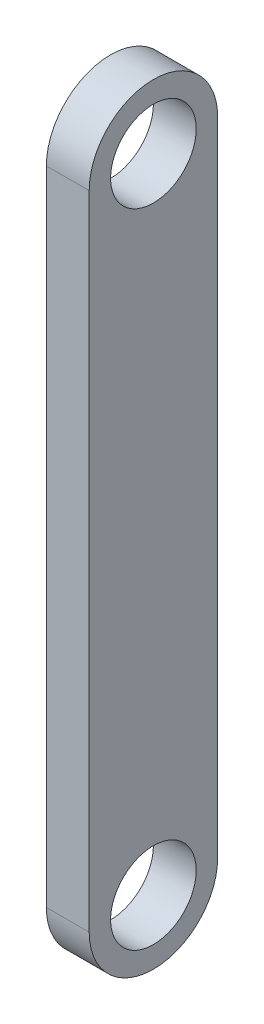
ISO-10303-21;
HEADER;
FILE_DESCRIPTION(('STEP AP214'),'2;1');
FILE_NAME('part.step','',(''),(''),'','','');
FILE_SCHEMA(('AUTOMOTIVE_DESIGN { 1 0 10303 214 1 1 1 1 }'));
ENDSEC;
DATA;
#1=APPLICATION_CONTEXT('core data for automotive mechanical design processes');
#2=APPLICATION_PROTOCOL_DEFINITION('international standard','automotive_design',2000,#1);
#3=PRODUCT_CONTEXT('',#1,'mechanical');
#4=PRODUCT('Part','Part','',(#3));
#5=PRODUCT_RELATED_PRODUCT_CATEGORY('part','',(#4));
#6=PRODUCT_DEFINITION_FORMATION('','',#4);
#7=PRODUCT_DEFINITION_CONTEXT('part definition',#1,'design');
#8=PRODUCT_DEFINITION('design','',#6,#7);
#9=PRODUCT_DEFINITION_SHAPE('','',#8);
#10=(LENGTH_UNIT() NAMED_UNIT(*) SI_UNIT(.MILLI.,.METRE.));
#11=(NAMED_UNIT(*) PLANE_ANGLE_UNIT() SI_UNIT($,.RADIAN.));
#12=(NAMED_UNIT(*) SI_UNIT($,.STERADIAN.) SOLID_ANGLE_UNIT());
#13=UNCERTAINTY_MEASURE_WITH_UNIT(LENGTH_MEASURE(1.E-05),#10,'distance_accuracy_value','');
#14=(GEOMETRIC_REPRESENTATION_CONTEXT(3) GLOBAL_UNCERTAINTY_ASSIGNED_CONTEXT((#13)) GLOBAL_UNIT_ASSIGNED_CONTEXT((#10,
#11,#12)) REPRESENTATION_CONTEXT('',''));
#15=CARTESIAN_POINT('',(0.,0.,0.));
#16=DIRECTION('',(0.,0.,1.));
#17=DIRECTION('',(1.,0.,0.));
#18=AXIS2_PLACEMENT_3D('',#15,#16,#17);
#19=CARTESIAN_POINT('',(2.,0.,-19.9139746963622));
#20=DIRECTION('',(0.,0.,1.));
#21=DIRECTION('',(1.,0.,0.));
#22=AXIS2_PLACEMENT_3D('',#19,#20,#21);
#23=PLANE('',#22);
#24=DIRECTION('',(0.,1.,0.));
#25=VECTOR('',#24,1.);
#26=CARTESIAN_POINT('',(0.,0.,-19.9139746963622));
#27=LINE('',#26,#25);
#28=CARTESIAN_POINT('',(0.,10.8023023568565,-19.9139746963622));
#29=VERTEX_POINT('',#28);
#30=CARTESIAN_POINT('',(0.,40.8023023568565,-19.9139746963622));
#31=VERTEX_POINT('',#30);
#32=EDGE_CURVE('E108',#29,#31,#27,.T.);
#33=ORIENTED_EDGE('',*,*,#32,.F.);
#34=DIRECTION('',(-1.,0.,0.));
#35=VECTOR('',#34,1.);
#36=CARTESIAN_POINT('',(2.,10.8023023568565,-19.9139746963622));
#37=LINE('',#36,#35);
#38=CARTESIAN_POINT('',(2.,10.8023023568565,-19.9139746963622));
#39=VERTEX_POINT('',#38);
#40=EDGE_CURVE('E11',#39,#29,#37,.T.);
#41=ORIENTED_EDGE('',*,*,#40,.F.);
#42=DIRECTION('',(0.,1.,0.));
#43=VECTOR('',#42,1.);
#44=CARTESIAN_POINT('',(2.,0.,-19.9139746963622));
#45=LINE('',#44,#43);
#46=CARTESIAN_POINT('',(2.,40.8023023568565,-19.9139746963622));
#47=VERTEX_POINT('',#46);
#48=EDGE_CURVE('E87',#39,#47,#45,.T.);
#49=ORIENTED_EDGE('',*,*,#48,.T.);
#50=DIRECTION('',(-1.,0.,0.));
#51=VECTOR('',#50,1.);
#52=CARTESIAN_POINT('',(2.,40.8023023568565,-19.9139746963622));
#53=LINE('',#52,#51);
#54=EDGE_CURVE('E76',#47,#31,#53,.T.);
#55=ORIENTED_EDGE('',*,*,#54,.T.);
#56=EDGE_LOOP('',(#33,#41,#49,#55));
#57=FACE_BOUND('',#56,.T.);
#58=ADVANCED_FACE('F37',(#57),#23,.T.);
#59=CARTESIAN_POINT('',(2.,10.8023023568565,-22.9139746963622));
#60=DIRECTION('',(-1.,0.,0.));
#61=DIRECTION('',(0.,0.,1.));
#62=AXIS2_PLACEMENT_3D('',#59,#60,#61);
#63=CYLINDRICAL_SURFACE('',#62,3.);
#64=CARTESIAN_POINT('',(0.,10.8023023568565,-22.9139746963622));
#65=DIRECTION('',(1.,0.,0.));
#66=DIRECTION('',(0.,0.,-1.));
#67=AXIS2_PLACEMENT_3D('',#64,#65,#66);
#68=CIRCLE('',#67,3.);
#69=CARTESIAN_POINT('',(0.,10.8023023568565,-25.9139746963622));
#70=VERTEX_POINT('',#69);
#71=EDGE_CURVE('E93',#29,#70,#68,.T.);
#72=ORIENTED_EDGE('',*,*,#71,.T.);
#73=DIRECTION('',(-1.,0.,0.));
#74=VECTOR('',#73,1.);
#75=CARTESIAN_POINT('',(2.,10.8023023568565,-25.9139746963622));
#76=LINE('',#75,#74);
#77=CARTESIAN_POINT('',(2.,10.8023023568565,-25.9139746963622));
#78=VERTEX_POINT('',#77);
#79=EDGE_CURVE('E46',#78,#70,#76,.T.);
#80=ORIENTED_EDGE('',*,*,#79,.F.);
#81=CARTESIAN_POINT('',(2.,10.8023023568565,-22.9139746963622));
#82=DIRECTION('',(1.,0.,0.));
#83=DIRECTION('',(0.,0.,-1.));
#84=AXIS2_PLACEMENT_3D('',#81,#82,#83);
#85=CIRCLE('',#84,3.);
#86=EDGE_CURVE('E81',#39,#78,#85,.T.);
#87=ORIENTED_EDGE('',*,*,#86,.F.);
#88=ORIENTED_EDGE('',*,*,#40,.T.);
#89=EDGE_LOOP('',(#72,#80,#87,#88));
#90=FACE_BOUND('',#89,.T.);
#91=ADVANCED_FACE('F91',(#90),#63,.T.);
#92=CARTESIAN_POINT('',(2.,0.,-25.9139746963622));
#93=DIRECTION('',(0.,0.,-1.));
#94=DIRECTION('',(-1.,0.,0.));
#95=AXIS2_PLACEMENT_3D('',#92,#93,#94);
#96=PLANE('',#95);
#97=DIRECTION('',(0.,-1.,0.));
#98=VECTOR('',#97,1.);
#99=CARTESIAN_POINT('',(0.,0.,-25.9139746963622));
#100=LINE('',#99,#98);
#101=CARTESIAN_POINT('',(0.,40.8023023568565,-25.9139746963622));
#102=VERTEX_POINT('',#101);
#103=EDGE_CURVE('E112',#102,#70,#100,.T.);
#104=ORIENTED_EDGE('',*,*,#103,.F.);
#105=DIRECTION('',(-1.,0.,0.));
#106=VECTOR('',#105,1.);
#107=CARTESIAN_POINT('',(2.,40.8023023568565,-25.9139746963622));
#108=LINE('',#107,#106);
#109=CARTESIAN_POINT('',(2.,40.8023023568565,-25.9139746963622));
#110=VERTEX_POINT('',#109);
#111=EDGE_CURVE('E69',#110,#102,#108,.T.);
#112=ORIENTED_EDGE('',*,*,#111,.F.);
#113=DIRECTION('',(0.,-1.,0.));
#114=VECTOR('',#113,1.);
#115=CARTESIAN_POINT('',(2.,0.,-25.9139746963622));
#116=LINE('',#115,#114);
#117=EDGE_CURVE('E86',#110,#78,#116,.T.);
#118=ORIENTED_EDGE('',*,*,#117,.T.);
#119=ORIENTED_EDGE('',*,*,#79,.T.);
#120=EDGE_LOOP('',(#104,#112,#118,#119));
#121=FACE_BOUND('',#120,.T.);
#122=ADVANCED_FACE('F97',(#121),#96,.T.);
#123=CARTESIAN_POINT('',(2.,40.8023023568565,-22.9139746963622));
#124=DIRECTION('',(-1.,0.,0.));
#125=DIRECTION('',(0.,0.,1.));
#126=AXIS2_PLACEMENT_3D('',#123,#124,#125);
#127=CYLINDRICAL_SURFACE('',#126,3.);
#128=CARTESIAN_POINT('',(0.,40.8023023568565,-22.9139746963622));
#129=DIRECTION('',(1.,0.,0.));
#130=DIRECTION('',(0.,0.,-1.));
#131=AXIS2_PLACEMENT_3D('',#128,#129,#130);
#132=CIRCLE('',#131,3.);
#133=EDGE_CURVE('E114',#102,#31,#132,.T.);
#134=ORIENTED_EDGE('',*,*,#133,.T.);
#135=ORIENTED_EDGE('',*,*,#54,.F.);
#136=CARTESIAN_POINT('',(2.,40.8023023568565,-22.9139746963622));
#137=DIRECTION('',(1.,0.,0.));
#138=DIRECTION('',(0.,0.,-1.));
#139=AXIS2_PLACEMENT_3D('',#136,#137,#138);
#140=CIRCLE('',#139,3.);
#141=EDGE_CURVE('E54',#110,#47,#140,.T.);
#142=ORIENTED_EDGE('',*,*,#141,.F.);
#143=ORIENTED_EDGE('',*,*,#111,.T.);
#144=EDGE_LOOP('',(#134,#135,#142,#143));
#145=FACE_BOUND('',#144,.T.);
#146=ADVANCED_FACE('F135',(#145),#127,.T.);
#147=CARTESIAN_POINT('',(2.,10.8023023568565,-22.9139746963622));
#148=DIRECTION('',(-1.,0.,0.));
#149=DIRECTION('',(0.,0.,1.));
#150=AXIS2_PLACEMENT_3D('',#147,#148,#149);
#151=CYLINDRICAL_SURFACE('',#150,2.);
#152=CARTESIAN_POINT('',(2.,10.8023023568565,-22.9139746963622));
#153=DIRECTION('',(1.,0.,0.));
#154=DIRECTION('',(0.,0.,-1.));
#155=AXIS2_PLACEMENT_3D('',#152,#153,#154);
#156=CIRCLE('',#155,2.);
#157=CARTESIAN_POINT('',(2.,10.8023023568565,-24.9139746963622));
#158=VERTEX_POINT('',#157);
#159=EDGE_CURVE('E119',#158,#158,#156,.T.);
#160=ORIENTED_EDGE('',*,*,#159,.T.);
#161=EDGE_LOOP('',(#160));
#162=FACE_BOUND('',#161,.T.);
#163=CARTESIAN_POINT('',(0.,10.8023023568565,-22.9139746963622));
#164=DIRECTION('',(1.,0.,0.));
#165=DIRECTION('',(0.,0.,-1.));
#166=AXIS2_PLACEMENT_3D('',#163,#164,#165);
#167=CIRCLE('',#166,2.);
#168=CARTESIAN_POINT('',(0.,10.8023023568565,-24.9139746963622));
#169=VERTEX_POINT('',#168);
#170=EDGE_CURVE('E105',#169,#169,#167,.T.);
#171=ORIENTED_EDGE('',*,*,#170,.F.);
#172=EDGE_LOOP('',(#171));
#173=FACE_BOUND('',#172,.T.);
#174=ADVANCED_FACE('F39',(#162,#173),#151,.F.);
#175=CARTESIAN_POINT('',(2.,40.8023023568565,-22.9139746963622));
#176=DIRECTION('',(-1.,0.,0.));
#177=DIRECTION('',(0.,0.,1.));
#178=AXIS2_PLACEMENT_3D('',#175,#176,#177);
#179=CYLINDRICAL_SURFACE('',#178,2.);
#180=CARTESIAN_POINT('',(2.,40.8023023568565,-22.9139746963622));
#181=DIRECTION('',(1.,0.,0.));
#182=DIRECTION('',(0.,0.,-1.));
#183=AXIS2_PLACEMENT_3D('',#180,#181,#182);
#184=CIRCLE('',#183,2.);
#185=CARTESIAN_POINT('',(2.,40.8023023568565,-24.9139746963622));
#186=VERTEX_POINT('',#185);
#187=EDGE_CURVE('E99',#186,#186,#184,.T.);
#188=ORIENTED_EDGE('',*,*,#187,.T.);
#189=EDGE_LOOP('',(#188));
#190=FACE_BOUND('',#189,.T.);
#191=CARTESIAN_POINT('',(0.,40.8023023568565,-22.9139746963622));
#192=DIRECTION('',(1.,0.,0.));
#193=DIRECTION('',(0.,0.,-1.));
#194=AXIS2_PLACEMENT_3D('',#191,#192,#193);
#195=CIRCLE('',#194,2.);
#196=CARTESIAN_POINT('',(0.,40.8023023568565,-24.9139746963622));
#197=VERTEX_POINT('',#196);
#198=EDGE_CURVE('E116',#197,#197,#195,.T.);
#199=ORIENTED_EDGE('',*,*,#198,.F.);
#200=EDGE_LOOP('',(#199));
#201=FACE_BOUND('',#200,.T.);
#202=ADVANCED_FACE('F138',(#190,#201),#179,.F.);
#203=CARTESIAN_POINT('',(2.,0.,0.));
#204=DIRECTION('',(1.,0.,0.));
#205=DIRECTION('',(0.,0.,-1.));
#206=AXIS2_PLACEMENT_3D('',#203,#204,#205);
#207=PLANE('',#206);
#208=ORIENTED_EDGE('',*,*,#159,.F.);
#209=EDGE_LOOP('',(#208));
#210=FACE_BOUND('',#209,.T.);
#211=ORIENTED_EDGE('',*,*,#48,.F.);
#212=ORIENTED_EDGE('',*,*,#86,.T.);
#213=ORIENTED_EDGE('',*,*,#117,.F.);
#214=ORIENTED_EDGE('',*,*,#141,.T.);
#215=EDGE_LOOP('',(#211,#212,#213,#214));
#216=FACE_BOUND('',#215,.T.);
#217=ORIENTED_EDGE('',*,*,#187,.F.);
#218=EDGE_LOOP('',(#217));
#219=FACE_BOUND('',#218,.T.);
#220=ADVANCED_FACE('F83',(#210,#216,#219),#207,.T.);
#221=CARTESIAN_POINT('',(0.,0.,0.));
#222=DIRECTION('',(1.,0.,0.));
#223=DIRECTION('',(0.,0.,-1.));
#224=AXIS2_PLACEMENT_3D('',#221,#222,#223);
#225=PLANE('',#224);
#226=ORIENTED_EDGE('',*,*,#170,.T.);
#227=EDGE_LOOP('',(#226));
#228=FACE_BOUND('',#227,.T.);
#229=ORIENTED_EDGE('',*,*,#32,.T.);
#230=ORIENTED_EDGE('',*,*,#133,.F.);
#231=ORIENTED_EDGE('',*,*,#103,.T.);
#232=ORIENTED_EDGE('',*,*,#71,.F.);
#233=EDGE_LOOP('',(#229,#230,#231,#232));
#234=FACE_BOUND('',#233,.T.);
#235=ORIENTED_EDGE('',*,*,#198,.T.);
#236=EDGE_LOOP('',(#235));
#237=FACE_BOUND('',#236,.T.);
#238=ADVANCED_FACE('F142',(#228,#234,#237),#225,.F.);
#239=CLOSED_SHELL('',(#58,#91,#122,#146,#174,#202,#220,#238));
#240=MANIFOLD_SOLID_BREP('B2',#239);
#241=ADVANCED_BREP_SHAPE_REPRESENTATION('',(#18,#240),#14);
#242=SHAPE_DEFINITION_REPRESENTATION(#9,#241);
ENDSEC;
END-ISO-10303-21;
